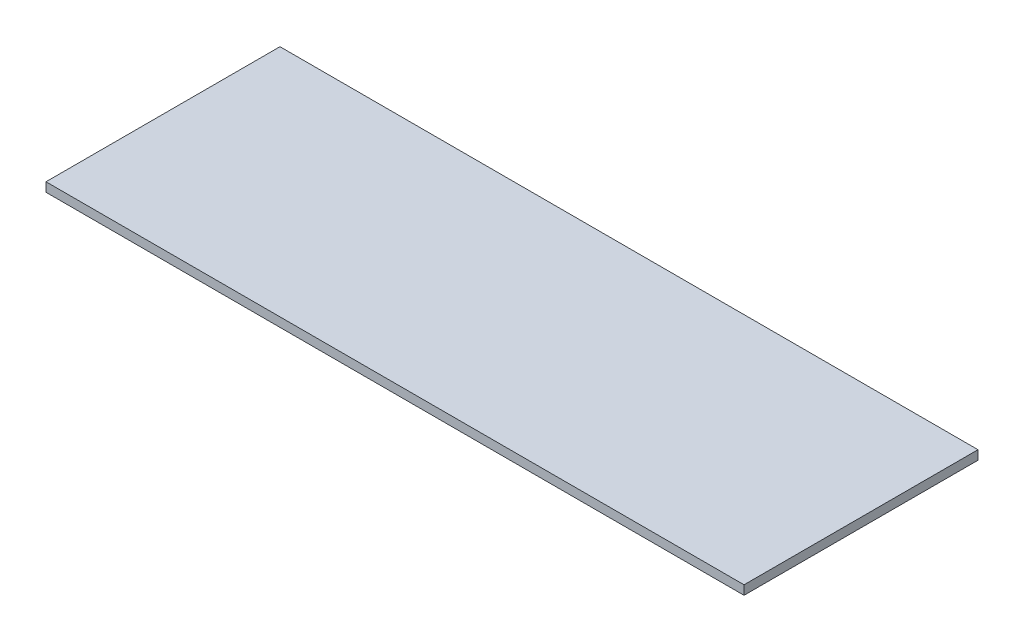
ISO-10303-21;
HEADER;
FILE_DESCRIPTION(('STEP AP214'),'2;1');
FILE_NAME('part.step','',(''),(''),'','','');
FILE_SCHEMA(('AUTOMOTIVE_DESIGN { 1 0 10303 214 1 1 1 1 }'));
ENDSEC;
DATA;
#1=APPLICATION_CONTEXT('core data for automotive mechanical design processes');
#2=APPLICATION_PROTOCOL_DEFINITION('international standard','automotive_design',2000,#1);
#3=PRODUCT_CONTEXT('',#1,'mechanical');
#4=PRODUCT('Part','Part','',(#3));
#5=PRODUCT_RELATED_PRODUCT_CATEGORY('part','',(#4));
#6=PRODUCT_DEFINITION_FORMATION('','',#4);
#7=PRODUCT_DEFINITION_CONTEXT('part definition',#1,'design');
#8=PRODUCT_DEFINITION('design','',#6,#7);
#9=PRODUCT_DEFINITION_SHAPE('','',#8);
#10=(LENGTH_UNIT() NAMED_UNIT(*) SI_UNIT(.MILLI.,.METRE.));
#11=(NAMED_UNIT(*) PLANE_ANGLE_UNIT() SI_UNIT($,.RADIAN.));
#12=(NAMED_UNIT(*) SI_UNIT($,.STERADIAN.) SOLID_ANGLE_UNIT());
#13=UNCERTAINTY_MEASURE_WITH_UNIT(LENGTH_MEASURE(1.E-05),#10,'distance_accuracy_value','');
#14=(GEOMETRIC_REPRESENTATION_CONTEXT(3) GLOBAL_UNCERTAINTY_ASSIGNED_CONTEXT((#13)) GLOBAL_UNIT_ASSIGNED_CONTEXT((#10,
#11,#12)) REPRESENTATION_CONTEXT('',''));
#15=CARTESIAN_POINT('',(0.,0.,0.));
#16=DIRECTION('',(0.,0.,1.));
#17=DIRECTION('',(1.,0.,0.));
#18=AXIS2_PLACEMENT_3D('',#15,#16,#17);
#19=CARTESIAN_POINT('',(-59.1289481870498,4.7625,-93.5994815794485));
#20=DIRECTION('',(1.,0.,0.));
#21=DIRECTION('',(0.,0.,-1.));
#22=AXIS2_PLACEMENT_3D('',#19,#20,#21);
#23=PLANE('',#22);
#24=DIRECTION('',(0.,0.,1.));
#25=VECTOR('',#24,1.);
#26=CARTESIAN_POINT('',(-59.1289481870498,0.,-93.5994815794485));
#27=LINE('',#26,#25);
#28=CARTESIAN_POINT('',(-59.1289481870498,0.,-93.5994815794485));
#29=VERTEX_POINT('',#28);
#30=CARTESIAN_POINT('',(-59.1289481870498,0.,28.4005184205515));
#31=VERTEX_POINT('',#30);
#32=EDGE_CURVE('E98',#29,#31,#27,.T.);
#33=ORIENTED_EDGE('',*,*,#32,.T.);
#34=DIRECTION('',(0.,-1.,0.));
#35=VECTOR('',#34,1.);
#36=CARTESIAN_POINT('',(-59.1289481870498,4.7625,28.4005184205515));
#37=LINE('',#36,#35);
#38=CARTESIAN_POINT('',(-59.1289481870498,4.7625,28.4005184205515));
#39=VERTEX_POINT('',#38);
#40=EDGE_CURVE('E11',#39,#31,#37,.T.);
#41=ORIENTED_EDGE('',*,*,#40,.F.);
#42=DIRECTION('',(0.,0.,1.));
#43=VECTOR('',#42,1.);
#44=CARTESIAN_POINT('',(-59.1289481870498,4.7625,-93.5994815794485));
#45=LINE('',#44,#43);
#46=CARTESIAN_POINT('',(-59.1289481870498,4.7625,-93.5994815794485));
#47=VERTEX_POINT('',#46);
#48=EDGE_CURVE('E86',#47,#39,#45,.T.);
#49=ORIENTED_EDGE('',*,*,#48,.F.);
#50=DIRECTION('',(0.,-1.,0.));
#51=VECTOR('',#50,1.);
#52=CARTESIAN_POINT('',(-59.1289481870498,4.7625,-93.5994815794485));
#53=LINE('',#52,#51);
#54=EDGE_CURVE('E94',#47,#29,#53,.T.);
#55=ORIENTED_EDGE('',*,*,#54,.T.);
#56=EDGE_LOOP('',(#33,#41,#49,#55));
#57=FACE_BOUND('',#56,.T.);
#58=ADVANCED_FACE('F35',(#57),#23,.F.);
#59=CARTESIAN_POINT('',(-59.1289481870498,4.7625,28.4005184205515));
#60=DIRECTION('',(0.,0.,-1.));
#61=DIRECTION('',(-1.,0.,0.));
#62=AXIS2_PLACEMENT_3D('',#59,#60,#61);
#63=PLANE('',#62);
#64=DIRECTION('',(1.,0.,0.));
#65=VECTOR('',#64,1.);
#66=CARTESIAN_POINT('',(-59.1289481870498,0.,28.4005184205515));
#67=LINE('',#66,#65);
#68=CARTESIAN_POINT('',(304.87105181295,0.,28.4005184205515));
#69=VERTEX_POINT('',#68);
#70=EDGE_CURVE('E90',#31,#69,#67,.T.);
#71=ORIENTED_EDGE('',*,*,#70,.T.);
#72=DIRECTION('',(0.,-1.,0.));
#73=VECTOR('',#72,1.);
#74=CARTESIAN_POINT('',(304.87105181295,4.7625,28.4005184205515));
#75=LINE('',#74,#73);
#76=CARTESIAN_POINT('',(304.87105181295,4.7625,28.4005184205515));
#77=VERTEX_POINT('',#76);
#78=EDGE_CURVE('E43',#77,#69,#75,.T.);
#79=ORIENTED_EDGE('',*,*,#78,.F.);
#80=DIRECTION('',(1.,0.,0.));
#81=VECTOR('',#80,1.);
#82=CARTESIAN_POINT('',(-59.1289481870498,4.7625,28.4005184205515));
#83=LINE('',#82,#81);
#84=EDGE_CURVE('E81',#39,#77,#83,.T.);
#85=ORIENTED_EDGE('',*,*,#84,.F.);
#86=ORIENTED_EDGE('',*,*,#40,.T.);
#87=EDGE_LOOP('',(#71,#79,#85,#86));
#88=FACE_BOUND('',#87,.T.);
#89=ADVANCED_FACE('F89',(#88),#63,.F.);
#90=CARTESIAN_POINT('',(304.87105181295,4.7625,-93.5994815794485));
#91=DIRECTION('',(-1.,0.,0.));
#92=DIRECTION('',(0.,0.,1.));
#93=AXIS2_PLACEMENT_3D('',#90,#91,#92);
#94=PLANE('',#93);
#95=DIRECTION('',(0.,0.,-1.));
#96=VECTOR('',#95,1.);
#97=CARTESIAN_POINT('',(304.87105181295,0.,-93.5994815794485));
#98=LINE('',#97,#96);
#99=CARTESIAN_POINT('',(304.87105181295,0.,-93.5994815794485));
#100=VERTEX_POINT('',#99);
#101=EDGE_CURVE('E68',#69,#100,#98,.T.);
#102=ORIENTED_EDGE('',*,*,#101,.T.);
#103=DIRECTION('',(0.,-1.,0.));
#104=VECTOR('',#103,1.);
#105=CARTESIAN_POINT('',(304.87105181295,4.7625,-93.5994815794485));
#106=LINE('',#105,#104);
#107=CARTESIAN_POINT('',(304.87105181295,4.7625,-93.5994815794485));
#108=VERTEX_POINT('',#107);
#109=EDGE_CURVE('E91',#108,#100,#106,.T.);
#110=ORIENTED_EDGE('',*,*,#109,.F.);
#111=DIRECTION('',(0.,0.,-1.));
#112=VECTOR('',#111,1.);
#113=CARTESIAN_POINT('',(304.87105181295,4.7625,-93.5994815794485));
#114=LINE('',#113,#112);
#115=EDGE_CURVE('E84',#77,#108,#114,.T.);
#116=ORIENTED_EDGE('',*,*,#115,.F.);
#117=ORIENTED_EDGE('',*,*,#78,.T.);
#118=EDGE_LOOP('',(#102,#110,#116,#117));
#119=FACE_BOUND('',#118,.T.);
#120=ADVANCED_FACE('F92',(#119),#94,.F.);
#121=CARTESIAN_POINT('',(-59.1289481870498,4.7625,-93.5994815794485));
#122=DIRECTION('',(0.,0.,1.));
#123=DIRECTION('',(1.,0.,0.));
#124=AXIS2_PLACEMENT_3D('',#121,#122,#123);
#125=PLANE('',#124);
#126=DIRECTION('',(-1.,0.,0.));
#127=VECTOR('',#126,1.);
#128=CARTESIAN_POINT('',(-59.1289481870498,0.,-93.5994815794485));
#129=LINE('',#128,#127);
#130=EDGE_CURVE('E74',#100,#29,#129,.T.);
#131=ORIENTED_EDGE('',*,*,#130,.T.);
#132=ORIENTED_EDGE('',*,*,#54,.F.);
#133=DIRECTION('',(-1.,0.,0.));
#134=VECTOR('',#133,1.);
#135=CARTESIAN_POINT('',(-59.1289481870498,4.7625,-93.5994815794485));
#136=LINE('',#135,#134);
#137=EDGE_CURVE('E51',#108,#47,#136,.T.);
#138=ORIENTED_EDGE('',*,*,#137,.F.);
#139=ORIENTED_EDGE('',*,*,#109,.T.);
#140=EDGE_LOOP('',(#131,#132,#138,#139));
#141=FACE_BOUND('',#140,.T.);
#142=ADVANCED_FACE('F105',(#141),#125,.F.);
#143=CARTESIAN_POINT('',(0.,4.7625,0.));
#144=DIRECTION('',(0.,1.,0.));
#145=DIRECTION('',(0.,0.,1.));
#146=AXIS2_PLACEMENT_3D('',#143,#144,#145);
#147=PLANE('',#146);
#148=ORIENTED_EDGE('',*,*,#48,.T.);
#149=ORIENTED_EDGE('',*,*,#84,.T.);
#150=ORIENTED_EDGE('',*,*,#115,.T.);
#151=ORIENTED_EDGE('',*,*,#137,.T.);
#152=EDGE_LOOP('',(#148,#149,#150,#151));
#153=FACE_BOUND('',#152,.T.);
#154=ADVANCED_FACE('F82',(#153),#147,.T.);
#155=CARTESIAN_POINT('',(0.,0.,0.));
#156=DIRECTION('',(0.,1.,0.));
#157=DIRECTION('',(0.,0.,1.));
#158=AXIS2_PLACEMENT_3D('',#155,#156,#157);
#159=PLANE('',#158);
#160=ORIENTED_EDGE('',*,*,#32,.F.);
#161=ORIENTED_EDGE('',*,*,#130,.F.);
#162=ORIENTED_EDGE('',*,*,#101,.F.);
#163=ORIENTED_EDGE('',*,*,#70,.F.);
#164=EDGE_LOOP('',(#160,#161,#162,#163));
#165=FACE_BOUND('',#164,.T.);
#166=ADVANCED_FACE('F108',(#165),#159,.F.);
#167=CLOSED_SHELL('',(#58,#89,#120,#142,#154,#166));
#168=MANIFOLD_SOLID_BREP('B2',#167);
#169=ADVANCED_BREP_SHAPE_REPRESENTATION('',(#18,#168),#14);
#170=SHAPE_DEFINITION_REPRESENTATION(#9,#169);
ENDSEC;
END-ISO-10303-21;
